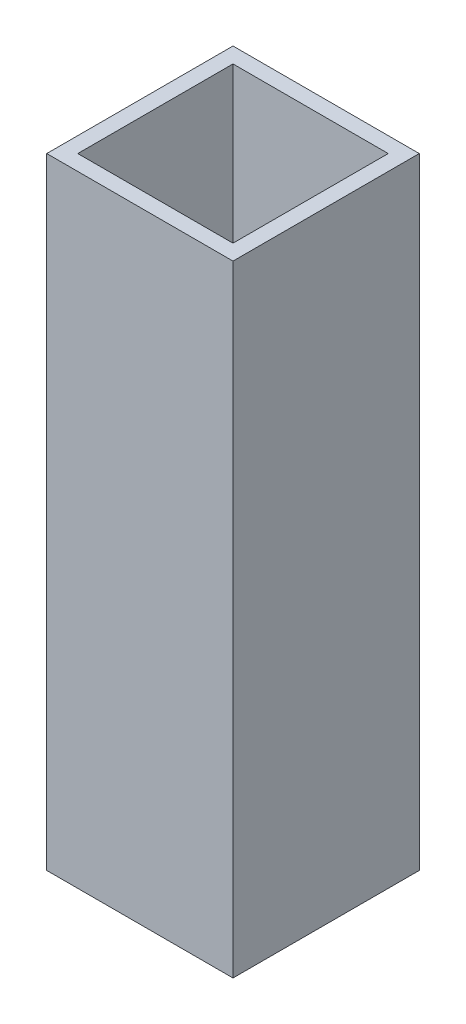
ISO-10303-21;
HEADER;
FILE_DESCRIPTION(('STEP AP214'),'2;1');
FILE_NAME('part.step','',(''),(''),'','','');
FILE_SCHEMA(('AUTOMOTIVE_DESIGN { 1 0 10303 214 1 1 1 1 }'));
ENDSEC;
DATA;
#1=APPLICATION_CONTEXT('core data for automotive mechanical design processes');
#2=APPLICATION_PROTOCOL_DEFINITION('international standard','automotive_design',2000,#1);
#3=PRODUCT_CONTEXT('',#1,'mechanical');
#4=PRODUCT('Part','Part','',(#3));
#5=PRODUCT_RELATED_PRODUCT_CATEGORY('part','',(#4));
#6=PRODUCT_DEFINITION_FORMATION('','',#4);
#7=PRODUCT_DEFINITION_CONTEXT('part definition',#1,'design');
#8=PRODUCT_DEFINITION('design','',#6,#7);
#9=PRODUCT_DEFINITION_SHAPE('','',#8);
#10=(LENGTH_UNIT() NAMED_UNIT(*) SI_UNIT(.MILLI.,.METRE.));
#11=(NAMED_UNIT(*) PLANE_ANGLE_UNIT() SI_UNIT($,.RADIAN.));
#12=(NAMED_UNIT(*) SI_UNIT($,.STERADIAN.) SOLID_ANGLE_UNIT());
#13=UNCERTAINTY_MEASURE_WITH_UNIT(LENGTH_MEASURE(1.E-05),#10,'distance_accuracy_value','');
#14=(GEOMETRIC_REPRESENTATION_CONTEXT(3) GLOBAL_UNCERTAINTY_ASSIGNED_CONTEXT((#13)) GLOBAL_UNIT_ASSIGNED_CONTEXT((#10,
#11,#12)) REPRESENTATION_CONTEXT('',''));
#15=CARTESIAN_POINT('',(0.,0.,0.));
#16=DIRECTION('',(0.,0.,1.));
#17=DIRECTION('',(1.,0.,0.));
#18=AXIS2_PLACEMENT_3D('',#15,#16,#17);
#19=CARTESIAN_POINT('',(0.,103.5,0.));
#20=DIRECTION('',(0.,-1.,0.));
#21=DIRECTION('',(0.,0.,-1.));
#22=AXIS2_PLACEMENT_3D('',#19,#20,#21);
#23=PLANE('',#22);
#24=DIRECTION('',(0.,0.,-1.));
#25=VECTOR('',#24,1.);
#26=CARTESIAN_POINT('',(20.,103.5,6.));
#27=LINE('',#26,#25);
#28=CARTESIAN_POINT('',(20.,103.5,6.));
#29=VERTEX_POINT('',#28);
#30=CARTESIAN_POINT('',(20.,103.5,-6.));
#31=VERTEX_POINT('',#30);
#32=EDGE_CURVE('E131',#29,#31,#27,.T.);
#33=ORIENTED_EDGE('',*,*,#32,.T.);
#34=DIRECTION('',(-1.,0.,0.));
#35=VECTOR('',#34,1.);
#36=CARTESIAN_POINT('',(8.,103.5,-6.));
#37=LINE('',#36,#35);
#38=CARTESIAN_POINT('',(8.,103.5,-6.));
#39=VERTEX_POINT('',#38);
#40=EDGE_CURVE('E132',#31,#39,#37,.T.);
#41=ORIENTED_EDGE('',*,*,#40,.T.);
#42=DIRECTION('',(0.,0.,1.));
#43=VECTOR('',#42,1.);
#44=CARTESIAN_POINT('',(8.,103.5,6.));
#45=LINE('',#44,#43);
#46=CARTESIAN_POINT('',(8.,103.5,6.));
#47=VERTEX_POINT('',#46);
#48=EDGE_CURVE('E138',#39,#47,#45,.T.);
#49=ORIENTED_EDGE('',*,*,#48,.T.);
#50=DIRECTION('',(1.,0.,0.));
#51=VECTOR('',#50,1.);
#52=CARTESIAN_POINT('',(8.,103.5,6.));
#53=LINE('',#52,#51);
#54=EDGE_CURVE('E136',#47,#29,#53,.T.);
#55=ORIENTED_EDGE('',*,*,#54,.T.);
#56=EDGE_LOOP('',(#33,#41,#49,#55));
#57=FACE_BOUND('',#56,.T.);
#58=DIRECTION('',(0.,0.,-1.));
#59=VECTOR('',#58,1.);
#60=CARTESIAN_POINT('',(19.,103.5,5.));
#61=LINE('',#60,#59);
#62=CARTESIAN_POINT('',(19.,103.5,5.));
#63=VERTEX_POINT('',#62);
#64=CARTESIAN_POINT('',(19.,103.5,-5.));
#65=VERTEX_POINT('',#64);
#66=EDGE_CURVE('E104',#63,#65,#61,.T.);
#67=ORIENTED_EDGE('',*,*,#66,.F.);
#68=DIRECTION('',(1.,0.,0.));
#69=VECTOR('',#68,1.);
#70=CARTESIAN_POINT('',(9.,103.5,5.));
#71=LINE('',#70,#69);
#72=CARTESIAN_POINT('',(9.,103.5,5.));
#73=VERTEX_POINT('',#72);
#74=EDGE_CURVE('E124',#73,#63,#71,.T.);
#75=ORIENTED_EDGE('',*,*,#74,.F.);
#76=DIRECTION('',(0.,0.,1.));
#77=VECTOR('',#76,1.);
#78=CARTESIAN_POINT('',(9.,103.5,5.));
#79=LINE('',#78,#77);
#80=CARTESIAN_POINT('',(9.,103.5,-5.));
#81=VERTEX_POINT('',#80);
#82=EDGE_CURVE('E123',#81,#73,#79,.T.);
#83=ORIENTED_EDGE('',*,*,#82,.F.);
#84=DIRECTION('',(-1.,0.,0.));
#85=VECTOR('',#84,1.);
#86=CARTESIAN_POINT('',(9.,103.5,-5.));
#87=LINE('',#86,#85);
#88=EDGE_CURVE('E115',#65,#81,#87,.T.);
#89=ORIENTED_EDGE('',*,*,#88,.F.);
#90=EDGE_LOOP('',(#67,#75,#83,#89));
#91=FACE_BOUND('',#90,.T.);
#92=ADVANCED_FACE('F41',(#57,#91),#23,.F.);
#93=CARTESIAN_POINT('',(0.,63.5,0.));
#94=DIRECTION('',(0.,-1.,0.));
#95=DIRECTION('',(0.,0.,-1.));
#96=AXIS2_PLACEMENT_3D('',#93,#94,#95);
#97=PLANE('',#96);
#98=DIRECTION('',(0.,0.,-1.));
#99=VECTOR('',#98,1.);
#100=CARTESIAN_POINT('',(20.,63.5,6.));
#101=LINE('',#100,#99);
#102=CARTESIAN_POINT('',(20.,63.5,6.));
#103=VERTEX_POINT('',#102);
#104=CARTESIAN_POINT('',(20.,63.5,-6.));
#105=VERTEX_POINT('',#104);
#106=EDGE_CURVE('E118',#103,#105,#101,.T.);
#107=ORIENTED_EDGE('',*,*,#106,.F.);
#108=DIRECTION('',(1.,0.,0.));
#109=VECTOR('',#108,1.);
#110=CARTESIAN_POINT('',(8.,63.5,6.));
#111=LINE('',#110,#109);
#112=CARTESIAN_POINT('',(8.,63.5,6.));
#113=VERTEX_POINT('',#112);
#114=EDGE_CURVE('E137',#113,#103,#111,.T.);
#115=ORIENTED_EDGE('',*,*,#114,.F.);
#116=DIRECTION('',(0.,0.,1.));
#117=VECTOR('',#116,1.);
#118=CARTESIAN_POINT('',(8.,63.5,6.));
#119=LINE('',#118,#117);
#120=CARTESIAN_POINT('',(8.,63.5,-6.));
#121=VERTEX_POINT('',#120);
#122=EDGE_CURVE('E150',#121,#113,#119,.T.);
#123=ORIENTED_EDGE('',*,*,#122,.F.);
#124=DIRECTION('',(-1.,0.,0.));
#125=VECTOR('',#124,1.);
#126=CARTESIAN_POINT('',(8.,63.5,-6.));
#127=LINE('',#126,#125);
#128=EDGE_CURVE('E144',#105,#121,#127,.T.);
#129=ORIENTED_EDGE('',*,*,#128,.F.);
#130=EDGE_LOOP('',(#107,#115,#123,#129));
#131=FACE_BOUND('',#130,.T.);
#132=DIRECTION('',(1.,0.,0.));
#133=VECTOR('',#132,1.);
#134=CARTESIAN_POINT('',(0.,63.5,5.));
#135=LINE('',#134,#133);
#136=CARTESIAN_POINT('',(9.,63.5,5.));
#137=VERTEX_POINT('',#136);
#138=CARTESIAN_POINT('',(19.,63.5,5.));
#139=VERTEX_POINT('',#138);
#140=EDGE_CURVE('E161',#137,#139,#135,.T.);
#141=ORIENTED_EDGE('',*,*,#140,.T.);
#142=DIRECTION('',(0.,0.,-1.));
#143=VECTOR('',#142,1.);
#144=CARTESIAN_POINT('',(19.,63.5,0.));
#145=LINE('',#144,#143);
#146=CARTESIAN_POINT('',(19.,63.5,-5.));
#147=VERTEX_POINT('',#146);
#148=EDGE_CURVE('E11',#139,#147,#145,.T.);
#149=ORIENTED_EDGE('',*,*,#148,.T.);
#150=DIRECTION('',(-1.,0.,0.));
#151=VECTOR('',#150,1.);
#152=CARTESIAN_POINT('',(0.,63.5,-5.));
#153=LINE('',#152,#151);
#154=CARTESIAN_POINT('',(9.,63.5,-5.));
#155=VERTEX_POINT('',#154);
#156=EDGE_CURVE('E47',#147,#155,#153,.T.);
#157=ORIENTED_EDGE('',*,*,#156,.T.);
#158=DIRECTION('',(0.,0.,1.));
#159=VECTOR('',#158,1.);
#160=CARTESIAN_POINT('',(9.,63.5,0.));
#161=LINE('',#160,#159);
#162=EDGE_CURVE('E163',#155,#137,#161,.T.);
#163=ORIENTED_EDGE('',*,*,#162,.T.);
#164=EDGE_LOOP('',(#141,#149,#157,#163));
#165=FACE_BOUND('',#164,.T.);
#166=ADVANCED_FACE('F170',(#131,#165),#97,.T.);
#167=CARTESIAN_POINT('',(20.,103.5,6.));
#168=DIRECTION('',(-1.,0.,0.));
#169=DIRECTION('',(0.,0.,1.));
#170=AXIS2_PLACEMENT_3D('',#167,#168,#169);
#171=PLANE('',#170);
#172=ORIENTED_EDGE('',*,*,#106,.T.);
#173=DIRECTION('',(0.,-1.,0.));
#174=VECTOR('',#173,1.);
#175=CARTESIAN_POINT('',(20.,103.5,-6.));
#176=LINE('',#175,#174);
#177=EDGE_CURVE('E158',#31,#105,#176,.T.);
#178=ORIENTED_EDGE('',*,*,#177,.F.);
#179=ORIENTED_EDGE('',*,*,#32,.F.);
#180=DIRECTION('',(0.,-1.,0.));
#181=VECTOR('',#180,1.);
#182=CARTESIAN_POINT('',(20.,103.5,6.));
#183=LINE('',#182,#181);
#184=EDGE_CURVE('E142',#29,#103,#183,.T.);
#185=ORIENTED_EDGE('',*,*,#184,.T.);
#186=EDGE_LOOP('',(#172,#178,#179,#185));
#187=FACE_BOUND('',#186,.T.);
#188=ADVANCED_FACE('F43',(#187),#171,.F.);
#189=CARTESIAN_POINT('',(8.,103.5,-6.));
#190=DIRECTION('',(0.,0.,1.));
#191=DIRECTION('',(1.,0.,0.));
#192=AXIS2_PLACEMENT_3D('',#189,#190,#191);
#193=PLANE('',#192);
#194=ORIENTED_EDGE('',*,*,#128,.T.);
#195=DIRECTION('',(0.,-1.,0.));
#196=VECTOR('',#195,1.);
#197=CARTESIAN_POINT('',(8.,103.5,-6.));
#198=LINE('',#197,#196);
#199=EDGE_CURVE('E154',#39,#121,#198,.T.);
#200=ORIENTED_EDGE('',*,*,#199,.F.);
#201=ORIENTED_EDGE('',*,*,#40,.F.);
#202=ORIENTED_EDGE('',*,*,#177,.T.);
#203=EDGE_LOOP('',(#194,#200,#201,#202));
#204=FACE_BOUND('',#203,.T.);
#205=ADVANCED_FACE('F191',(#204),#193,.F.);
#206=CARTESIAN_POINT('',(8.,103.5,6.));
#207=DIRECTION('',(1.,0.,0.));
#208=DIRECTION('',(0.,0.,-1.));
#209=AXIS2_PLACEMENT_3D('',#206,#207,#208);
#210=PLANE('',#209);
#211=ORIENTED_EDGE('',*,*,#122,.T.);
#212=DIRECTION('',(0.,-1.,0.));
#213=VECTOR('',#212,1.);
#214=CARTESIAN_POINT('',(8.,103.5,6.));
#215=LINE('',#214,#213);
#216=EDGE_CURVE('E155',#47,#113,#215,.T.);
#217=ORIENTED_EDGE('',*,*,#216,.F.);
#218=ORIENTED_EDGE('',*,*,#48,.F.);
#219=ORIENTED_EDGE('',*,*,#199,.T.);
#220=EDGE_LOOP('',(#211,#217,#218,#219));
#221=FACE_BOUND('',#220,.T.);
#222=ADVANCED_FACE('F195',(#221),#210,.F.);
#223=CARTESIAN_POINT('',(8.,103.5,6.));
#224=DIRECTION('',(0.,0.,-1.));
#225=DIRECTION('',(-1.,0.,0.));
#226=AXIS2_PLACEMENT_3D('',#223,#224,#225);
#227=PLANE('',#226);
#228=ORIENTED_EDGE('',*,*,#114,.T.);
#229=ORIENTED_EDGE('',*,*,#184,.F.);
#230=ORIENTED_EDGE('',*,*,#54,.F.);
#231=ORIENTED_EDGE('',*,*,#216,.T.);
#232=EDGE_LOOP('',(#228,#229,#230,#231));
#233=FACE_BOUND('',#232,.T.);
#234=ADVANCED_FACE('F187',(#233),#227,.F.);
#235=CARTESIAN_POINT('',(19.,103.5,5.));
#236=DIRECTION('',(-1.,0.,0.));
#237=DIRECTION('',(0.,0.,1.));
#238=AXIS2_PLACEMENT_3D('',#235,#236,#237);
#239=PLANE('',#238);
#240=DIRECTION('',(0.,-1.,0.));
#241=VECTOR('',#240,1.);
#242=CARTESIAN_POINT('',(19.,103.5,5.));
#243=LINE('',#242,#241);
#244=EDGE_CURVE('E61',#63,#139,#243,.T.);
#245=ORIENTED_EDGE('',*,*,#244,.F.);
#246=ORIENTED_EDGE('',*,*,#66,.T.);
#247=DIRECTION('',(0.,-1.,0.));
#248=VECTOR('',#247,1.);
#249=CARTESIAN_POINT('',(19.,103.5,-5.));
#250=LINE('',#249,#248);
#251=EDGE_CURVE('E107',#65,#147,#250,.T.);
#252=ORIENTED_EDGE('',*,*,#251,.T.);
#253=ORIENTED_EDGE('',*,*,#148,.F.);
#254=EDGE_LOOP('',(#245,#246,#252,#253));
#255=FACE_BOUND('',#254,.T.);
#256=ADVANCED_FACE('F110',(#255),#239,.T.);
#257=CARTESIAN_POINT('',(9.,103.5,-5.));
#258=DIRECTION('',(0.,0.,1.));
#259=DIRECTION('',(1.,0.,0.));
#260=AXIS2_PLACEMENT_3D('',#257,#258,#259);
#261=PLANE('',#260);
#262=ORIENTED_EDGE('',*,*,#251,.F.);
#263=ORIENTED_EDGE('',*,*,#88,.T.);
#264=DIRECTION('',(0.,-1.,0.));
#265=VECTOR('',#264,1.);
#266=CARTESIAN_POINT('',(9.,103.5,-5.));
#267=LINE('',#266,#265);
#268=EDGE_CURVE('E119',#81,#155,#267,.T.);
#269=ORIENTED_EDGE('',*,*,#268,.T.);
#270=ORIENTED_EDGE('',*,*,#156,.F.);
#271=EDGE_LOOP('',(#262,#263,#269,#270));
#272=FACE_BOUND('',#271,.T.);
#273=ADVANCED_FACE('F113',(#272),#261,.T.);
#274=CARTESIAN_POINT('',(9.,103.5,5.));
#275=DIRECTION('',(1.,0.,0.));
#276=DIRECTION('',(0.,0.,-1.));
#277=AXIS2_PLACEMENT_3D('',#274,#275,#276);
#278=PLANE('',#277);
#279=ORIENTED_EDGE('',*,*,#268,.F.);
#280=ORIENTED_EDGE('',*,*,#82,.T.);
#281=DIRECTION('',(0.,-1.,0.));
#282=VECTOR('',#281,1.);
#283=CARTESIAN_POINT('',(9.,103.5,5.));
#284=LINE('',#283,#282);
#285=EDGE_CURVE('E57',#73,#137,#284,.T.);
#286=ORIENTED_EDGE('',*,*,#285,.T.);
#287=ORIENTED_EDGE('',*,*,#162,.F.);
#288=EDGE_LOOP('',(#279,#280,#286,#287));
#289=FACE_BOUND('',#288,.T.);
#290=ADVANCED_FACE('F168',(#289),#278,.T.);
#291=CARTESIAN_POINT('',(9.,103.5,5.));
#292=DIRECTION('',(0.,0.,-1.));
#293=DIRECTION('',(-1.,0.,0.));
#294=AXIS2_PLACEMENT_3D('',#291,#292,#293);
#295=PLANE('',#294);
#296=ORIENTED_EDGE('',*,*,#285,.F.);
#297=ORIENTED_EDGE('',*,*,#74,.T.);
#298=ORIENTED_EDGE('',*,*,#244,.T.);
#299=ORIENTED_EDGE('',*,*,#140,.F.);
#300=EDGE_LOOP('',(#296,#297,#298,#299));
#301=FACE_BOUND('',#300,.T.);
#302=ADVANCED_FACE('F169',(#301),#295,.T.);
#303=CLOSED_SHELL('',(#92,#166,#188,#205,#222,#234,#256,#273,#290,#302));
#304=MANIFOLD_SOLID_BREP('B2',#303);
#305=ADVANCED_BREP_SHAPE_REPRESENTATION('',(#18,#304),#14);
#306=SHAPE_DEFINITION_REPRESENTATION(#9,#305);
ENDSEC;
END-ISO-10303-21;
